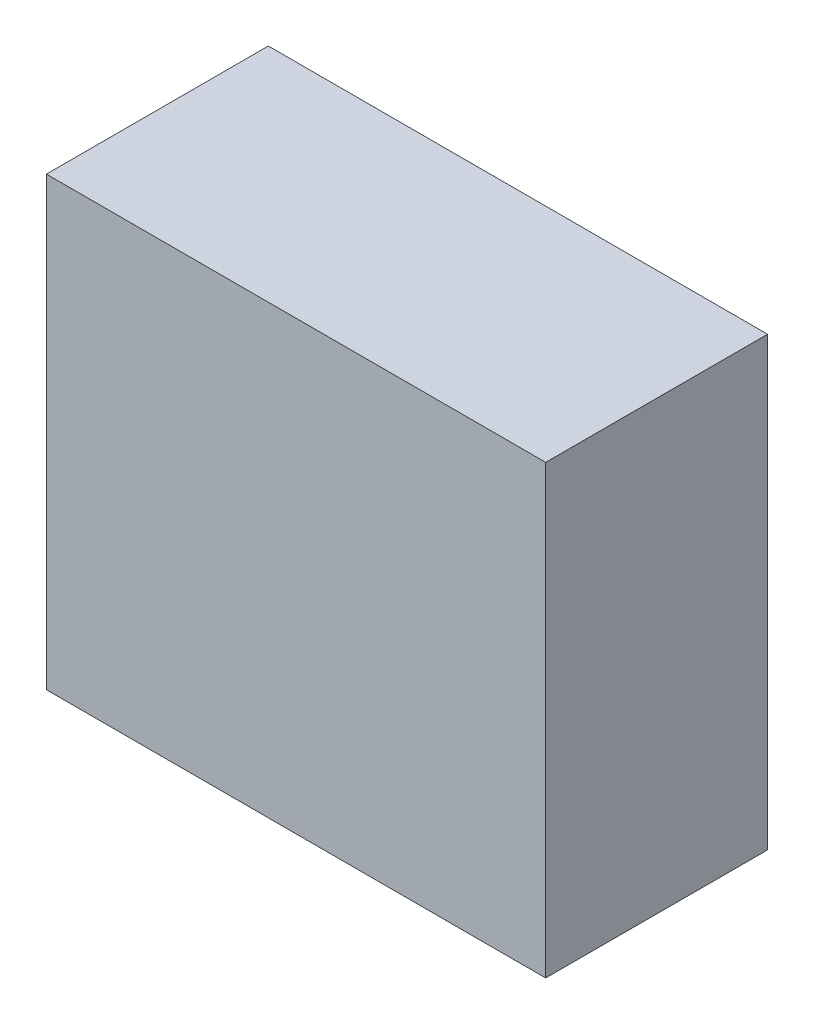
ISO-10303-21;
HEADER;
FILE_DESCRIPTION(('STEP AP214'),'2;1');
FILE_NAME('part.step','',(''),(''),'','','');
FILE_SCHEMA(('AUTOMOTIVE_DESIGN { 1 0 10303 214 1 1 1 1 }'));
ENDSEC;
DATA;
#1=APPLICATION_CONTEXT('core data for automotive mechanical design processes');
#2=APPLICATION_PROTOCOL_DEFINITION('international standard','automotive_design',2000,#1);
#3=PRODUCT_CONTEXT('',#1,'mechanical');
#4=PRODUCT('Part','Part','',(#3));
#5=PRODUCT_RELATED_PRODUCT_CATEGORY('part','',(#4));
#6=PRODUCT_DEFINITION_FORMATION('','',#4);
#7=PRODUCT_DEFINITION_CONTEXT('part definition',#1,'design');
#8=PRODUCT_DEFINITION('design','',#6,#7);
#9=PRODUCT_DEFINITION_SHAPE('','',#8);
#10=(LENGTH_UNIT() NAMED_UNIT(*) SI_UNIT(.MILLI.,.METRE.));
#11=(NAMED_UNIT(*) PLANE_ANGLE_UNIT() SI_UNIT($,.RADIAN.));
#12=(NAMED_UNIT(*) SI_UNIT($,.STERADIAN.) SOLID_ANGLE_UNIT());
#13=UNCERTAINTY_MEASURE_WITH_UNIT(LENGTH_MEASURE(1.E-05),#10,'distance_accuracy_value','');
#14=(GEOMETRIC_REPRESENTATION_CONTEXT(3) GLOBAL_UNCERTAINTY_ASSIGNED_CONTEXT((#13)) GLOBAL_UNIT_ASSIGNED_CONTEXT((#10,
#11,#12)) REPRESENTATION_CONTEXT('',''));
#15=CARTESIAN_POINT('',(0.,0.,0.));
#16=DIRECTION('',(0.,0.,1.));
#17=DIRECTION('',(1.,0.,0.));
#18=AXIS2_PLACEMENT_3D('',#15,#16,#17);
#19=CARTESIAN_POINT('',(0.,40.894,0.));
#20=DIRECTION('',(1.,0.,0.));
#21=DIRECTION('',(0.,0.,-1.));
#22=AXIS2_PLACEMENT_3D('',#19,#20,#21);
#23=PLANE('',#22);
#24=DIRECTION('',(0.,0.,1.));
#25=VECTOR('',#24,1.);
#26=CARTESIAN_POINT('',(0.,0.,0.));
#27=LINE('',#26,#25);
#28=CARTESIAN_POINT('',(0.,0.,-20.32));
#29=VERTEX_POINT('',#28);
#30=CARTESIAN_POINT('',(0.,0.,0.));
#31=VERTEX_POINT('',#30);
#32=EDGE_CURVE('E106',#29,#31,#27,.T.);
#33=ORIENTED_EDGE('',*,*,#32,.T.);
#34=DIRECTION('',(0.,-1.,0.));
#35=VECTOR('',#34,1.);
#36=CARTESIAN_POINT('',(0.,40.894,0.));
#37=LINE('',#36,#35);
#38=CARTESIAN_POINT('',(0.,40.894,0.));
#39=VERTEX_POINT('',#38);
#40=EDGE_CURVE('E11',#39,#31,#37,.T.);
#41=ORIENTED_EDGE('',*,*,#40,.F.);
#42=DIRECTION('',(0.,0.,1.));
#43=VECTOR('',#42,1.);
#44=CARTESIAN_POINT('',(0.,40.894,0.));
#45=LINE('',#44,#43);
#46=CARTESIAN_POINT('',(0.,40.894,-20.32));
#47=VERTEX_POINT('',#46);
#48=EDGE_CURVE('E94',#47,#39,#45,.T.);
#49=ORIENTED_EDGE('',*,*,#48,.F.);
#50=DIRECTION('',(0.,-1.,0.));
#51=VECTOR('',#50,1.);
#52=CARTESIAN_POINT('',(0.,40.894,-20.32));
#53=LINE('',#52,#51);
#54=EDGE_CURVE('E102',#47,#29,#53,.T.);
#55=ORIENTED_EDGE('',*,*,#54,.T.);
#56=EDGE_LOOP('',(#33,#41,#49,#55));
#57=FACE_BOUND('',#56,.T.);
#58=ADVANCED_FACE('F43',(#57),#23,.F.);
#59=CARTESIAN_POINT('',(0.,40.894,0.));
#60=DIRECTION('',(0.,0.,-1.));
#61=DIRECTION('',(-1.,0.,0.));
#62=AXIS2_PLACEMENT_3D('',#59,#60,#61);
#63=PLANE('',#62);
#64=DIRECTION('',(1.,0.,0.));
#65=VECTOR('',#64,1.);
#66=CARTESIAN_POINT('',(0.,0.,0.));
#67=LINE('',#66,#65);
#68=CARTESIAN_POINT('',(45.72,0.,0.));
#69=VERTEX_POINT('',#68);
#70=EDGE_CURVE('E98',#31,#69,#67,.T.);
#71=ORIENTED_EDGE('',*,*,#70,.T.);
#72=DIRECTION('',(0.,-1.,0.));
#73=VECTOR('',#72,1.);
#74=CARTESIAN_POINT('',(45.72,40.894,0.));
#75=LINE('',#74,#73);
#76=CARTESIAN_POINT('',(45.72,40.894,0.));
#77=VERTEX_POINT('',#76);
#78=EDGE_CURVE('E51',#77,#69,#75,.T.);
#79=ORIENTED_EDGE('',*,*,#78,.F.);
#80=DIRECTION('',(1.,0.,0.));
#81=VECTOR('',#80,1.);
#82=CARTESIAN_POINT('',(0.,40.894,0.));
#83=LINE('',#82,#81);
#84=EDGE_CURVE('E89',#39,#77,#83,.T.);
#85=ORIENTED_EDGE('',*,*,#84,.F.);
#86=ORIENTED_EDGE('',*,*,#40,.T.);
#87=EDGE_LOOP('',(#71,#79,#85,#86));
#88=FACE_BOUND('',#87,.T.);
#89=ADVANCED_FACE('F97',(#88),#63,.F.);
#90=CARTESIAN_POINT('',(45.72,40.894,0.));
#91=DIRECTION('',(-1.,0.,0.));
#92=DIRECTION('',(0.,0.,1.));
#93=AXIS2_PLACEMENT_3D('',#90,#91,#92);
#94=PLANE('',#93);
#95=DIRECTION('',(0.,0.,-1.));
#96=VECTOR('',#95,1.);
#97=CARTESIAN_POINT('',(45.72,0.,0.));
#98=LINE('',#97,#96);
#99=CARTESIAN_POINT('',(45.72,0.,-20.32));
#100=VERTEX_POINT('',#99);
#101=EDGE_CURVE('E76',#69,#100,#98,.T.);
#102=ORIENTED_EDGE('',*,*,#101,.T.);
#103=DIRECTION('',(0.,-1.,0.));
#104=VECTOR('',#103,1.);
#105=CARTESIAN_POINT('',(45.72,40.894,-20.32));
#106=LINE('',#105,#104);
#107=CARTESIAN_POINT('',(45.72,40.894,-20.32));
#108=VERTEX_POINT('',#107);
#109=EDGE_CURVE('E99',#108,#100,#106,.T.);
#110=ORIENTED_EDGE('',*,*,#109,.F.);
#111=DIRECTION('',(0.,0.,-1.));
#112=VECTOR('',#111,1.);
#113=CARTESIAN_POINT('',(45.72,40.894,0.));
#114=LINE('',#113,#112);
#115=EDGE_CURVE('E92',#77,#108,#114,.T.);
#116=ORIENTED_EDGE('',*,*,#115,.F.);
#117=ORIENTED_EDGE('',*,*,#78,.T.);
#118=EDGE_LOOP('',(#102,#110,#116,#117));
#119=FACE_BOUND('',#118,.T.);
#120=ADVANCED_FACE('F100',(#119),#94,.F.);
#121=CARTESIAN_POINT('',(0.,40.894,-20.32));
#122=DIRECTION('',(0.,0.,1.));
#123=DIRECTION('',(1.,0.,0.));
#124=AXIS2_PLACEMENT_3D('',#121,#122,#123);
#125=PLANE('',#124);
#126=DIRECTION('',(-1.,0.,0.));
#127=VECTOR('',#126,1.);
#128=CARTESIAN_POINT('',(0.,0.,-20.32));
#129=LINE('',#128,#127);
#130=EDGE_CURVE('E82',#100,#29,#129,.T.);
#131=ORIENTED_EDGE('',*,*,#130,.T.);
#132=ORIENTED_EDGE('',*,*,#54,.F.);
#133=DIRECTION('',(-1.,0.,0.));
#134=VECTOR('',#133,1.);
#135=CARTESIAN_POINT('',(0.,40.894,-20.32));
#136=LINE('',#135,#134);
#137=EDGE_CURVE('E59',#108,#47,#136,.T.);
#138=ORIENTED_EDGE('',*,*,#137,.F.);
#139=ORIENTED_EDGE('',*,*,#109,.T.);
#140=EDGE_LOOP('',(#131,#132,#138,#139));
#141=FACE_BOUND('',#140,.T.);
#142=ADVANCED_FACE('F113',(#141),#125,.F.);
#143=CARTESIAN_POINT('',(0.,40.894,0.));
#144=DIRECTION('',(0.,-1.,0.));
#145=DIRECTION('',(0.,0.,-1.));
#146=AXIS2_PLACEMENT_3D('',#143,#144,#145);
#147=PLANE('',#146);
#148=ORIENTED_EDGE('',*,*,#48,.T.);
#149=ORIENTED_EDGE('',*,*,#84,.T.);
#150=ORIENTED_EDGE('',*,*,#115,.T.);
#151=ORIENTED_EDGE('',*,*,#137,.T.);
#152=EDGE_LOOP('',(#148,#149,#150,#151));
#153=FACE_BOUND('',#152,.T.);
#154=ADVANCED_FACE('F90',(#153),#147,.F.);
#155=CARTESIAN_POINT('',(0.,0.,0.));
#156=DIRECTION('',(0.,-1.,0.));
#157=DIRECTION('',(0.,0.,-1.));
#158=AXIS2_PLACEMENT_3D('',#155,#156,#157);
#159=PLANE('',#158);
#160=ORIENTED_EDGE('',*,*,#32,.F.);
#161=ORIENTED_EDGE('',*,*,#130,.F.);
#162=ORIENTED_EDGE('',*,*,#101,.F.);
#163=ORIENTED_EDGE('',*,*,#70,.F.);
#164=EDGE_LOOP('',(#160,#161,#162,#163));
#165=FACE_BOUND('',#164,.T.);
#166=ADVANCED_FACE('F116',(#165),#159,.T.);
#167=CLOSED_SHELL('',(#58,#89,#120,#142,#154,#166));
#168=MANIFOLD_SOLID_BREP('B2',#167);
#169=ADVANCED_BREP_SHAPE_REPRESENTATION('',(#18,#168),#14);
#170=SHAPE_DEFINITION_REPRESENTATION(#9,#169);
ENDSEC;
END-ISO-10303-21;
